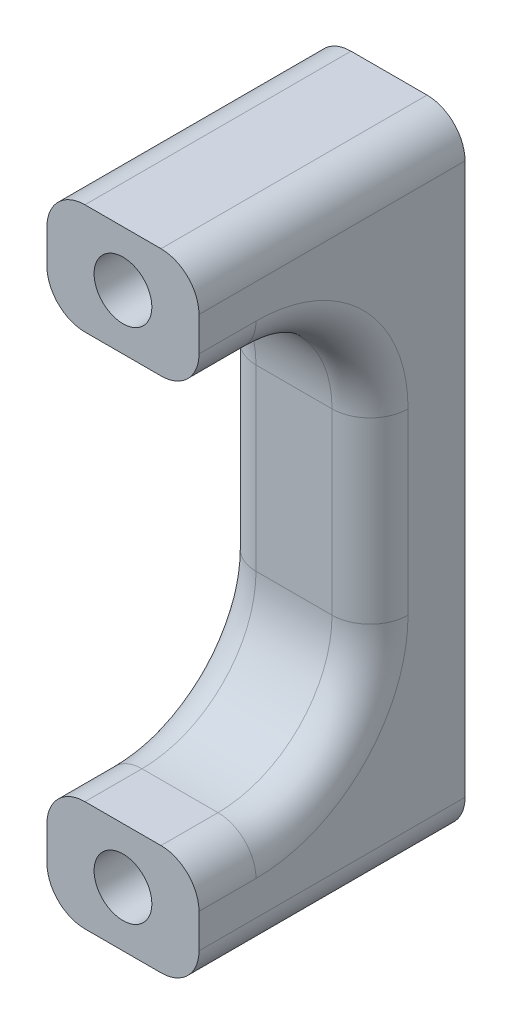
ISO-10303-21;
HEADER;
FILE_DESCRIPTION(('STEP AP214'),'2;1');
FILE_NAME('part.step','',(''),(''),'','','');
FILE_SCHEMA(('AUTOMOTIVE_DESIGN { 1 0 10303 214 1 1 1 1 }'));
ENDSEC;
DATA;
#1=APPLICATION_CONTEXT('core data for automotive mechanical design processes');
#2=APPLICATION_PROTOCOL_DEFINITION('international standard','automotive_design',2000,#1);
#3=PRODUCT_CONTEXT('',#1,'mechanical');
#4=PRODUCT('Part','Part','',(#3));
#5=PRODUCT_RELATED_PRODUCT_CATEGORY('part','',(#4));
#6=PRODUCT_DEFINITION_FORMATION('','',#4);
#7=PRODUCT_DEFINITION_CONTEXT('part definition',#1,'design');
#8=PRODUCT_DEFINITION('design','',#6,#7);
#9=PRODUCT_DEFINITION_SHAPE('','',#8);
#10=(LENGTH_UNIT() NAMED_UNIT(*) SI_UNIT(.MILLI.,.METRE.));
#11=(NAMED_UNIT(*) PLANE_ANGLE_UNIT() SI_UNIT($,.RADIAN.));
#12=(NAMED_UNIT(*) SI_UNIT($,.STERADIAN.) SOLID_ANGLE_UNIT());
#13=UNCERTAINTY_MEASURE_WITH_UNIT(LENGTH_MEASURE(1.E-05),#10,'distance_accuracy_value','');
#14=(GEOMETRIC_REPRESENTATION_CONTEXT(3) GLOBAL_UNCERTAINTY_ASSIGNED_CONTEXT((#13)) GLOBAL_UNIT_ASSIGNED_CONTEXT((#10,
#11,#12)) REPRESENTATION_CONTEXT('',''));
#15=CARTESIAN_POINT('',(0.,0.,0.));
#16=DIRECTION('',(0.,0.,1.));
#17=DIRECTION('',(1.,0.,0.));
#18=AXIS2_PLACEMENT_3D('',#15,#16,#17);
#19=CARTESIAN_POINT('',(0.,0.,17.78));
#20=DIRECTION('',(0.,0.,-1.));
#21=DIRECTION('',(-1.,0.,0.));
#22=AXIS2_PLACEMENT_3D('',#19,#20,#21);
#23=PLANE('',#22);
#24=DIRECTION('',(0.,1.,0.));
#25=VECTOR('',#24,1.);
#26=CARTESIAN_POINT('',(10.16,0.,17.78));
#27=LINE('',#26,#25);
#28=CARTESIAN_POINT('',(10.16,37.084,17.78));
#29=VERTEX_POINT('',#28);
#30=CARTESIAN_POINT('',(10.16,39.37,17.78));
#31=VERTEX_POINT('',#30);
#32=EDGE_CURVE('E302',#29,#31,#27,.T.);
#33=ORIENTED_EDGE('',*,*,#32,.T.);
#34=CARTESIAN_POINT('',(7.61999999999999,39.37,17.78));
#35=DIRECTION('',(0.,0.,-1.));
#36=DIRECTION('',(-1.,0.,0.));
#37=AXIS2_PLACEMENT_3D('',#34,#35,#36);
#38=CIRCLE('',#37,2.54);
#39=CARTESIAN_POINT('',(7.61999999999999,41.91,17.78));
#40=VERTEX_POINT('',#39);
#41=EDGE_CURVE('E438',#31,#40,#38,.F.);
#42=ORIENTED_EDGE('',*,*,#41,.T.);
#43=DIRECTION('',(-1.,0.,0.));
#44=VECTOR('',#43,1.);
#45=CARTESIAN_POINT('',(0.,41.91,17.78));
#46=LINE('',#45,#44);
#47=CARTESIAN_POINT('',(2.53999999999999,41.91,17.78));
#48=VERTEX_POINT('',#47);
#49=EDGE_CURVE('E307',#40,#48,#46,.T.);
#50=ORIENTED_EDGE('',*,*,#49,.T.);
#51=CARTESIAN_POINT('',(2.53999999999999,39.37,17.78));
#52=DIRECTION('',(0.,0.,-1.));
#53=DIRECTION('',(-1.,0.,0.));
#54=AXIS2_PLACEMENT_3D('',#51,#52,#53);
#55=CIRCLE('',#54,2.54);
#56=CARTESIAN_POINT('',(0.,39.37,17.78));
#57=VERTEX_POINT('',#56);
#58=EDGE_CURVE('E435',#48,#57,#55,.F.);
#59=ORIENTED_EDGE('',*,*,#58,.T.);
#60=DIRECTION('',(0.,-1.,0.));
#61=VECTOR('',#60,1.);
#62=CARTESIAN_POINT('',(0.,0.,17.78));
#63=LINE('',#62,#61);
#64=CARTESIAN_POINT('',(0.,37.084,17.78));
#65=VERTEX_POINT('',#64);
#66=EDGE_CURVE('E294',#57,#65,#63,.T.);
#67=ORIENTED_EDGE('',*,*,#66,.T.);
#68=CARTESIAN_POINT('',(2.53999999999999,37.084,17.78));
#69=DIRECTION('',(0.,0.,-1.));
#70=DIRECTION('',(-1.,0.,0.));
#71=AXIS2_PLACEMENT_3D('',#68,#69,#70);
#72=CIRCLE('',#71,2.54);
#73=CARTESIAN_POINT('',(2.53999999999999,34.544,17.78));
#74=VERTEX_POINT('',#73);
#75=EDGE_CURVE('E61',#65,#74,#72,.F.);
#76=ORIENTED_EDGE('',*,*,#75,.T.);
#77=DIRECTION('',(-1.,0.,0.));
#78=VECTOR('',#77,1.);
#79=CARTESIAN_POINT('',(0.,34.544,17.78));
#80=LINE('',#79,#78);
#81=CARTESIAN_POINT('',(7.61999999999999,34.544,17.78));
#82=VERTEX_POINT('',#81);
#83=EDGE_CURVE('E288',#82,#74,#80,.T.);
#84=ORIENTED_EDGE('',*,*,#83,.F.);
#85=CARTESIAN_POINT('',(7.61999999999999,37.084,17.78));
#86=DIRECTION('',(0.,0.,-1.));
#87=DIRECTION('',(-1.,0.,0.));
#88=AXIS2_PLACEMENT_3D('',#85,#86,#87);
#89=CIRCLE('',#88,2.54);
#90=EDGE_CURVE('E430',#82,#29,#89,.F.);
#91=ORIENTED_EDGE('',*,*,#90,.T.);
#92=EDGE_LOOP('',(#33,#42,#50,#59,#67,#76,#84,#91));
#93=FACE_BOUND('',#92,.T.);
#94=CARTESIAN_POINT('',(5.08,38.227,17.78));
#95=DIRECTION('',(0.,0.,1.));
#96=DIRECTION('',(1.,0.,0.));
#97=AXIS2_PLACEMENT_3D('',#94,#95,#96);
#98=CIRCLE('',#97,1.9304);
#99=CARTESIAN_POINT('',(7.0104,38.227,17.78));
#100=VERTEX_POINT('',#99);
#101=EDGE_CURVE('E278',#100,#100,#98,.T.);
#102=ORIENTED_EDGE('',*,*,#101,.F.);
#103=EDGE_LOOP('',(#102));
#104=FACE_BOUND('',#103,.T.);
#105=ADVANCED_FACE('F43',(#93,#104),#23,.F.);
#106=CARTESIAN_POINT('',(5.08,3.683,17.78));
#107=DIRECTION('',(0.,0.,1.));
#108=DIRECTION('',(1.,0.,0.));
#109=AXIS2_PLACEMENT_3D('',#106,#107,#108);
#110=CIRCLE('',#109,1.9304);
#111=CARTESIAN_POINT('',(7.0104,3.683,17.78));
#112=VERTEX_POINT('',#111);
#113=EDGE_CURVE('E265',#112,#112,#110,.T.);
#114=ORIENTED_EDGE('',*,*,#113,.F.);
#115=EDGE_LOOP('',(#114));
#116=FACE_BOUND('',#115,.T.);
#117=DIRECTION('',(1.,0.,0.));
#118=VECTOR('',#117,1.);
#119=CARTESIAN_POINT('',(0.,7.366,17.78));
#120=LINE('',#119,#118);
#121=CARTESIAN_POINT('',(2.54,7.366,17.78));
#122=VERTEX_POINT('',#121);
#123=CARTESIAN_POINT('',(7.62,7.366,17.78));
#124=VERTEX_POINT('',#123);
#125=EDGE_CURVE('E191',#122,#124,#120,.T.);
#126=ORIENTED_EDGE('',*,*,#125,.F.);
#127=CARTESIAN_POINT('',(2.54,4.826,17.78));
#128=DIRECTION('',(0.,0.,-1.));
#129=DIRECTION('',(-1.,0.,0.));
#130=AXIS2_PLACEMENT_3D('',#127,#128,#129);
#131=CIRCLE('',#130,2.54);
#132=CARTESIAN_POINT('',(0.,4.826,17.78));
#133=VERTEX_POINT('',#132);
#134=EDGE_CURVE('E345',#122,#133,#131,.F.);
#135=ORIENTED_EDGE('',*,*,#134,.T.);
#136=CARTESIAN_POINT('',(0.,2.54,17.78));
#137=VERTEX_POINT('',#136);
#138=EDGE_CURVE('E298',#133,#137,#63,.T.);
#139=ORIENTED_EDGE('',*,*,#138,.T.);
#140=CARTESIAN_POINT('',(2.54,2.54,17.78));
#141=DIRECTION('',(0.,0.,-1.));
#142=DIRECTION('',(-1.,0.,0.));
#143=AXIS2_PLACEMENT_3D('',#140,#141,#142);
#144=CIRCLE('',#143,2.54);
#145=CARTESIAN_POINT('',(2.54,0.,17.78));
#146=VERTEX_POINT('',#145);
#147=EDGE_CURVE('E339',#137,#146,#144,.F.);
#148=ORIENTED_EDGE('',*,*,#147,.T.);
#149=DIRECTION('',(1.,0.,0.));
#150=VECTOR('',#149,1.);
#151=CARTESIAN_POINT('',(0.,0.,17.78));
#152=LINE('',#151,#150);
#153=CARTESIAN_POINT('',(7.62,0.,17.78));
#154=VERTEX_POINT('',#153);
#155=EDGE_CURVE('E297',#146,#154,#152,.T.);
#156=ORIENTED_EDGE('',*,*,#155,.T.);
#157=CARTESIAN_POINT('',(7.62,2.54,17.78));
#158=DIRECTION('',(0.,0.,-1.));
#159=DIRECTION('',(-1.,0.,0.));
#160=AXIS2_PLACEMENT_3D('',#157,#158,#159);
#161=CIRCLE('',#160,2.54);
#162=CARTESIAN_POINT('',(10.16,2.54,17.78));
#163=VERTEX_POINT('',#162);
#164=EDGE_CURVE('E336',#154,#163,#161,.F.);
#165=ORIENTED_EDGE('',*,*,#164,.T.);
#166=CARTESIAN_POINT('',(10.16,4.826,17.78));
#167=VERTEX_POINT('',#166);
#168=EDGE_CURVE('E306',#163,#167,#27,.T.);
#169=ORIENTED_EDGE('',*,*,#168,.T.);
#170=CARTESIAN_POINT('',(7.62,4.826,17.78));
#171=DIRECTION('',(0.,0.,-1.));
#172=DIRECTION('',(-1.,0.,0.));
#173=AXIS2_PLACEMENT_3D('',#170,#171,#172);
#174=CIRCLE('',#173,2.54);
#175=EDGE_CURVE('E342',#167,#124,#174,.F.);
#176=ORIENTED_EDGE('',*,*,#175,.T.);
#177=EDGE_LOOP('',(#126,#135,#139,#148,#156,#165,#169,#176));
#178=FACE_BOUND('',#177,.T.);
#179=ADVANCED_FACE('F448',(#116,#178),#23,.F.);
#180=CARTESIAN_POINT('',(0.,0.,17.78));
#181=DIRECTION('',(1.,0.,0.));
#182=DIRECTION('',(0.,1.,0.));
#183=AXIS2_PLACEMENT_3D('',#180,#181,#182);
#184=PLANE('',#183);
#185=DIRECTION('',(0.,-1.,0.));
#186=VECTOR('',#185,1.);
#187=CARTESIAN_POINT('',(0.,0.,0.));
#188=LINE('',#187,#186);
#189=CARTESIAN_POINT('',(0.,39.37,0.));
#190=VERTEX_POINT('',#189);
#191=CARTESIAN_POINT('',(0.,2.54,0.));
#192=VERTEX_POINT('',#191);
#193=EDGE_CURVE('E291',#190,#192,#188,.T.);
#194=ORIENTED_EDGE('',*,*,#193,.T.);
#195=DIRECTION('',(0.,0.,-1.));
#196=VECTOR('',#195,1.);
#197=CARTESIAN_POINT('',(0.,2.54,17.78));
#198=LINE('',#197,#196);
#199=EDGE_CURVE('E219',#192,#137,#198,.F.);
#200=ORIENTED_EDGE('',*,*,#199,.T.);
#201=ORIENTED_EDGE('',*,*,#138,.F.);
#202=DIRECTION('',(0.,0.,1.));
#203=VECTOR('',#202,1.);
#204=CARTESIAN_POINT('',(0.,4.826,17.78));
#205=LINE('',#204,#203);
#206=CARTESIAN_POINT('',(0.,4.826,13.97));
#207=VERTEX_POINT('',#206);
#208=EDGE_CURVE('E360',#133,#207,#205,.F.);
#209=ORIENTED_EDGE('',*,*,#208,.T.);
#210=CARTESIAN_POINT('',(0.,14.986,13.97));
#211=DIRECTION('',(1.,0.,0.));
#212=DIRECTION('',(0.,1.,0.));
#213=AXIS2_PLACEMENT_3D('',#210,#211,#212);
#214=CIRCLE('',#213,10.16);
#215=CARTESIAN_POINT('',(0.,14.986,3.81));
#216=VERTEX_POINT('',#215);
#217=EDGE_CURVE('E357',#207,#216,#214,.T.);
#218=ORIENTED_EDGE('',*,*,#217,.T.);
#219=DIRECTION('',(0.,-1.,0.));
#220=VECTOR('',#219,1.);
#221=CARTESIAN_POINT('',(0.,0.,3.81));
#222=LINE('',#221,#220);
#223=CARTESIAN_POINT('',(0.,26.924,3.81));
#224=VERTEX_POINT('',#223);
#225=EDGE_CURVE('E354',#216,#224,#222,.F.);
#226=ORIENTED_EDGE('',*,*,#225,.T.);
#227=CARTESIAN_POINT('',(0.,26.924,13.97));
#228=DIRECTION('',(1.,0.,0.));
#229=DIRECTION('',(0.,1.,0.));
#230=AXIS2_PLACEMENT_3D('',#227,#228,#229);
#231=CIRCLE('',#230,10.16);
#232=CARTESIAN_POINT('',(0.,37.084,13.97));
#233=VERTEX_POINT('',#232);
#234=EDGE_CURVE('E351',#224,#233,#231,.T.);
#235=ORIENTED_EDGE('',*,*,#234,.T.);
#236=DIRECTION('',(0.,0.,1.));
#237=VECTOR('',#236,1.);
#238=CARTESIAN_POINT('',(0.,37.084,17.78));
#239=LINE('',#238,#237);
#240=EDGE_CURVE('E348',#233,#65,#239,.T.);
#241=ORIENTED_EDGE('',*,*,#240,.T.);
#242=ORIENTED_EDGE('',*,*,#66,.F.);
#243=DIRECTION('',(0.,0.,-1.));
#244=VECTOR('',#243,1.);
#245=CARTESIAN_POINT('',(0.,39.37,17.78));
#246=LINE('',#245,#244);
#247=EDGE_CURVE('E363',#57,#190,#246,.T.);
#248=ORIENTED_EDGE('',*,*,#247,.T.);
#249=EDGE_LOOP('',(#194,#200,#201,#209,#218,#226,#235,#241,#242,#248));
#250=FACE_BOUND('',#249,.T.);
#251=ADVANCED_FACE('F495',(#250),#184,.F.);
#252=CARTESIAN_POINT('',(0.,0.,17.78));
#253=DIRECTION('',(0.,1.,0.));
#254=DIRECTION('',(0.,0.,1.));
#255=AXIS2_PLACEMENT_3D('',#252,#253,#254);
#256=PLANE('',#255);
#257=ORIENTED_EDGE('',*,*,#155,.F.);
#258=DIRECTION('',(0.,0.,-1.));
#259=VECTOR('',#258,1.);
#260=CARTESIAN_POINT('',(2.54,0.,17.78));
#261=LINE('',#260,#259);
#262=CARTESIAN_POINT('',(2.54,0.,0.));
#263=VERTEX_POINT('',#262);
#264=EDGE_CURVE('E407',#146,#263,#261,.T.);
#265=ORIENTED_EDGE('',*,*,#264,.T.);
#266=DIRECTION('',(1.,0.,0.));
#267=VECTOR('',#266,1.);
#268=CARTESIAN_POINT('',(0.,0.,0.));
#269=LINE('',#268,#267);
#270=CARTESIAN_POINT('',(7.62,0.,0.));
#271=VERTEX_POINT('',#270);
#272=EDGE_CURVE('E315',#263,#271,#269,.T.);
#273=ORIENTED_EDGE('',*,*,#272,.T.);
#274=DIRECTION('',(0.,0.,-1.));
#275=VECTOR('',#274,1.);
#276=CARTESIAN_POINT('',(7.62,0.,17.78));
#277=LINE('',#276,#275);
#278=EDGE_CURVE('E404',#271,#154,#277,.F.);
#279=ORIENTED_EDGE('',*,*,#278,.T.);
#280=EDGE_LOOP('',(#257,#265,#273,#279));
#281=FACE_BOUND('',#280,.T.);
#282=ADVANCED_FACE('F457',(#281),#256,.F.);
#283=CARTESIAN_POINT('',(10.16,0.,17.78));
#284=DIRECTION('',(-1.,0.,0.));
#285=DIRECTION('',(0.,-1.,0.));
#286=AXIS2_PLACEMENT_3D('',#283,#284,#285);
#287=PLANE('',#286);
#288=ORIENTED_EDGE('',*,*,#168,.F.);
#289=DIRECTION('',(0.,0.,-1.));
#290=VECTOR('',#289,1.);
#291=CARTESIAN_POINT('',(10.16,2.54,17.78));
#292=LINE('',#291,#290);
#293=CARTESIAN_POINT('',(10.16,2.54,0.));
#294=VERTEX_POINT('',#293);
#295=EDGE_CURVE('E400',#163,#294,#292,.T.);
#296=ORIENTED_EDGE('',*,*,#295,.T.);
#297=DIRECTION('',(0.,1.,0.));
#298=VECTOR('',#297,1.);
#299=CARTESIAN_POINT('',(10.16,0.,0.));
#300=LINE('',#299,#298);
#301=CARTESIAN_POINT('',(10.16,39.37,0.));
#302=VERTEX_POINT('',#301);
#303=EDGE_CURVE('E319',#294,#302,#300,.T.);
#304=ORIENTED_EDGE('',*,*,#303,.T.);
#305=DIRECTION('',(0.,0.,-1.));
#306=VECTOR('',#305,1.);
#307=CARTESIAN_POINT('',(10.16,39.37,17.78));
#308=LINE('',#307,#306);
#309=EDGE_CURVE('E397',#302,#31,#308,.F.);
#310=ORIENTED_EDGE('',*,*,#309,.T.);
#311=ORIENTED_EDGE('',*,*,#32,.F.);
#312=DIRECTION('',(0.,0.,1.));
#313=VECTOR('',#312,1.);
#314=CARTESIAN_POINT('',(10.16,37.084,17.78));
#315=LINE('',#314,#313);
#316=CARTESIAN_POINT('',(10.16,37.084,13.97));
#317=VERTEX_POINT('',#316);
#318=EDGE_CURVE('E383',#29,#317,#315,.F.);
#319=ORIENTED_EDGE('',*,*,#318,.T.);
#320=CARTESIAN_POINT('',(10.16,26.924,13.97));
#321=DIRECTION('',(-1.,0.,0.));
#322=DIRECTION('',(0.,-1.,0.));
#323=AXIS2_PLACEMENT_3D('',#320,#321,#322);
#324=CIRCLE('',#323,10.16);
#325=CARTESIAN_POINT('',(10.16,26.924,3.81));
#326=VERTEX_POINT('',#325);
#327=EDGE_CURVE('E386',#317,#326,#324,.T.);
#328=ORIENTED_EDGE('',*,*,#327,.T.);
#329=DIRECTION('',(0.,1.,0.));
#330=VECTOR('',#329,1.);
#331=CARTESIAN_POINT('',(10.16,0.,3.81));
#332=LINE('',#331,#330);
#333=CARTESIAN_POINT('',(10.16,14.986,3.81));
#334=VERTEX_POINT('',#333);
#335=EDGE_CURVE('E389',#326,#334,#332,.F.);
#336=ORIENTED_EDGE('',*,*,#335,.T.);
#337=CARTESIAN_POINT('',(10.16,14.986,13.97));
#338=DIRECTION('',(-1.,0.,0.));
#339=DIRECTION('',(0.,-1.,0.));
#340=AXIS2_PLACEMENT_3D('',#337,#338,#339);
#341=CIRCLE('',#340,10.16);
#342=CARTESIAN_POINT('',(10.16,4.826,13.97));
#343=VERTEX_POINT('',#342);
#344=EDGE_CURVE('E392',#334,#343,#341,.T.);
#345=ORIENTED_EDGE('',*,*,#344,.T.);
#346=DIRECTION('',(0.,0.,1.));
#347=VECTOR('',#346,1.);
#348=CARTESIAN_POINT('',(10.16,4.826,17.78));
#349=LINE('',#348,#347);
#350=EDGE_CURVE('E223',#343,#167,#349,.T.);
#351=ORIENTED_EDGE('',*,*,#350,.T.);
#352=EDGE_LOOP('',(#288,#296,#304,#310,#311,#319,#328,#336,#345,#351));
#353=FACE_BOUND('',#352,.T.);
#354=ADVANCED_FACE('F469',(#353),#287,.F.);
#355=CARTESIAN_POINT('',(0.,41.91,17.78));
#356=DIRECTION('',(0.,-1.,0.));
#357=DIRECTION('',(0.,0.,-1.));
#358=AXIS2_PLACEMENT_3D('',#355,#356,#357);
#359=PLANE('',#358);
#360=ORIENTED_EDGE('',*,*,#49,.F.);
#361=DIRECTION('',(0.,0.,-1.));
#362=VECTOR('',#361,1.);
#363=CARTESIAN_POINT('',(7.61999999999999,41.91,17.78));
#364=LINE('',#363,#362);
#365=CARTESIAN_POINT('',(7.61999999999999,41.91,0.));
#366=VERTEX_POINT('',#365);
#367=EDGE_CURVE('E426',#40,#366,#364,.T.);
#368=ORIENTED_EDGE('',*,*,#367,.T.);
#369=DIRECTION('',(-1.,0.,0.));
#370=VECTOR('',#369,1.);
#371=CARTESIAN_POINT('',(0.,41.91,0.));
#372=LINE('',#371,#370);
#373=CARTESIAN_POINT('',(2.53999999999999,41.91,0.));
#374=VERTEX_POINT('',#373);
#375=EDGE_CURVE('E323',#366,#374,#372,.T.);
#376=ORIENTED_EDGE('',*,*,#375,.T.);
#377=DIRECTION('',(0.,0.,-1.));
#378=VECTOR('',#377,1.);
#379=CARTESIAN_POINT('',(2.53999999999999,41.91,17.78));
#380=LINE('',#379,#378);
#381=EDGE_CURVE('E423',#374,#48,#380,.F.);
#382=ORIENTED_EDGE('',*,*,#381,.T.);
#383=EDGE_LOOP('',(#360,#368,#376,#382));
#384=FACE_BOUND('',#383,.T.);
#385=ADVANCED_FACE('F503',(#384),#359,.F.);
#386=CARTESIAN_POINT('',(0.,0.,0.));
#387=DIRECTION('',(0.,0.,-1.));
#388=DIRECTION('',(-1.,0.,0.));
#389=AXIS2_PLACEMENT_3D('',#386,#387,#388);
#390=PLANE('',#389);
#391=CARTESIAN_POINT('',(5.08,3.683,0.));
#392=DIRECTION('',(0.,0.,-1.));
#393=DIRECTION('',(-1.,0.,0.));
#394=AXIS2_PLACEMENT_3D('',#391,#392,#393);
#395=CIRCLE('',#394,1.9304);
#396=CARTESIAN_POINT('',(3.14960000000001,3.683,0.));
#397=VERTEX_POINT('',#396);
#398=EDGE_CURVE('E272',#397,#397,#395,.T.);
#399=ORIENTED_EDGE('',*,*,#398,.F.);
#400=EDGE_LOOP('',(#399));
#401=FACE_BOUND('',#400,.T.);
#402=CARTESIAN_POINT('',(5.08,38.227,0.));
#403=DIRECTION('',(0.,0.,-1.));
#404=DIRECTION('',(-1.,0.,0.));
#405=AXIS2_PLACEMENT_3D('',#402,#403,#404);
#406=CIRCLE('',#405,1.9304);
#407=CARTESIAN_POINT('',(3.14960000000001,38.227,0.));
#408=VERTEX_POINT('',#407);
#409=EDGE_CURVE('E284',#408,#408,#406,.T.);
#410=ORIENTED_EDGE('',*,*,#409,.F.);
#411=EDGE_LOOP('',(#410));
#412=FACE_BOUND('',#411,.T.);
#413=ORIENTED_EDGE('',*,*,#272,.F.);
#414=CARTESIAN_POINT('',(2.54,2.54,0.));
#415=DIRECTION('',(0.,0.,-1.));
#416=DIRECTION('',(-1.,0.,0.));
#417=AXIS2_PLACEMENT_3D('',#414,#415,#416);
#418=CIRCLE('',#417,2.54);
#419=EDGE_CURVE('E420',#263,#192,#418,.T.);
#420=ORIENTED_EDGE('',*,*,#419,.T.);
#421=ORIENTED_EDGE('',*,*,#193,.F.);
#422=CARTESIAN_POINT('',(2.53999999999999,39.37,0.));
#423=DIRECTION('',(0.,0.,-1.));
#424=DIRECTION('',(-1.,0.,0.));
#425=AXIS2_PLACEMENT_3D('',#422,#423,#424);
#426=CIRCLE('',#425,2.54);
#427=EDGE_CURVE('E411',#190,#374,#426,.T.);
#428=ORIENTED_EDGE('',*,*,#427,.T.);
#429=ORIENTED_EDGE('',*,*,#375,.F.);
#430=CARTESIAN_POINT('',(7.61999999999999,39.37,0.));
#431=DIRECTION('',(0.,0.,-1.));
#432=DIRECTION('',(-1.,0.,0.));
#433=AXIS2_PLACEMENT_3D('',#430,#431,#432);
#434=CIRCLE('',#433,2.54);
#435=EDGE_CURVE('E414',#366,#302,#434,.T.);
#436=ORIENTED_EDGE('',*,*,#435,.T.);
#437=ORIENTED_EDGE('',*,*,#303,.F.);
#438=CARTESIAN_POINT('',(7.62,2.54,0.));
#439=DIRECTION('',(0.,0.,-1.));
#440=DIRECTION('',(-1.,0.,0.));
#441=AXIS2_PLACEMENT_3D('',#438,#439,#440);
#442=CIRCLE('',#441,2.54);
#443=EDGE_CURVE('E417',#294,#271,#442,.T.);
#444=ORIENTED_EDGE('',*,*,#443,.T.);
#445=EDGE_LOOP('',(#413,#420,#421,#428,#429,#436,#437,#444));
#446=FACE_BOUND('',#445,.T.);
#447=ADVANCED_FACE('F460',(#401,#412,#446),#390,.T.);
#448=CARTESIAN_POINT('',(0.,0.,6.35));
#449=DIRECTION('',(0.,0.,-1.));
#450=DIRECTION('',(-1.,0.,0.));
#451=AXIS2_PLACEMENT_3D('',#448,#449,#450);
#452=PLANE('',#451);
#453=DIRECTION('',(-1.,0.,0.));
#454=VECTOR('',#453,1.);
#455=CARTESIAN_POINT('',(0.,26.924,6.35));
#456=LINE('',#455,#454);
#457=CARTESIAN_POINT('',(7.62,26.924,6.35));
#458=VERTEX_POINT('',#457);
#459=CARTESIAN_POINT('',(2.54,26.924,6.35));
#460=VERTEX_POINT('',#459);
#461=EDGE_CURVE('E311',#458,#460,#456,.T.);
#462=ORIENTED_EDGE('',*,*,#461,.T.);
#463=DIRECTION('',(0.,-1.,0.));
#464=VECTOR('',#463,1.);
#465=CARTESIAN_POINT('',(2.54,0.,6.35));
#466=LINE('',#465,#464);
#467=CARTESIAN_POINT('',(2.54,14.986,6.35));
#468=VERTEX_POINT('',#467);
#469=EDGE_CURVE('E374',#460,#468,#466,.T.);
#470=ORIENTED_EDGE('',*,*,#469,.T.);
#471=DIRECTION('',(1.,0.,0.));
#472=VECTOR('',#471,1.);
#473=CARTESIAN_POINT('',(10.16,14.986,6.35));
#474=LINE('',#473,#472);
#475=CARTESIAN_POINT('',(7.62,14.986,6.35));
#476=VERTEX_POINT('',#475);
#477=EDGE_CURVE('E207',#468,#476,#474,.T.);
#478=ORIENTED_EDGE('',*,*,#477,.T.);
#479=DIRECTION('',(0.,1.,0.));
#480=VECTOR('',#479,1.);
#481=CARTESIAN_POINT('',(7.62,0.,6.35));
#482=LINE('',#481,#480);
#483=EDGE_CURVE('E371',#476,#458,#482,.T.);
#484=ORIENTED_EDGE('',*,*,#483,.T.);
#485=EDGE_LOOP('',(#462,#470,#478,#484));
#486=FACE_BOUND('',#485,.T.);
#487=ADVANCED_FACE('F474',(#486),#452,.F.);
#488=CARTESIAN_POINT('',(0.,7.366,-29.014983784245));
#489=DIRECTION('',(0.,-1.,0.));
#490=DIRECTION('',(0.,0.,-1.));
#491=AXIS2_PLACEMENT_3D('',#488,#489,#490);
#492=PLANE('',#491);
#493=DIRECTION('',(1.,0.,0.));
#494=VECTOR('',#493,1.);
#495=CARTESIAN_POINT('',(0.,7.366,13.97));
#496=LINE('',#495,#494);
#497=CARTESIAN_POINT('',(7.62,7.366,13.97));
#498=VERTEX_POINT('',#497);
#499=CARTESIAN_POINT('',(2.54,7.366,13.97));
#500=VERTEX_POINT('',#499);
#501=EDGE_CURVE('E188',#498,#500,#496,.F.);
#502=ORIENTED_EDGE('',*,*,#501,.T.);
#503=DIRECTION('',(0.,0.,1.));
#504=VECTOR('',#503,1.);
#505=CARTESIAN_POINT('',(2.54,7.366,-29.014983784245));
#506=LINE('',#505,#504);
#507=EDGE_CURVE('E195',#500,#122,#506,.T.);
#508=ORIENTED_EDGE('',*,*,#507,.T.);
#509=ORIENTED_EDGE('',*,*,#125,.T.);
#510=DIRECTION('',(0.,0.,1.));
#511=VECTOR('',#510,1.);
#512=CARTESIAN_POINT('',(7.62,7.366,-29.014983784245));
#513=LINE('',#512,#511);
#514=EDGE_CURVE('E184',#124,#498,#513,.F.);
#515=ORIENTED_EDGE('',*,*,#514,.T.);
#516=EDGE_LOOP('',(#502,#508,#509,#515));
#517=FACE_BOUND('',#516,.T.);
#518=ADVANCED_FACE('F186',(#517),#492,.F.);
#519=CARTESIAN_POINT('',(0.,34.544,-29.014983784245));
#520=DIRECTION('',(0.,1.,0.));
#521=DIRECTION('',(0.,0.,1.));
#522=AXIS2_PLACEMENT_3D('',#519,#520,#521);
#523=PLANE('',#522);
#524=ORIENTED_EDGE('',*,*,#83,.T.);
#525=DIRECTION('',(0.,0.,1.));
#526=VECTOR('',#525,1.);
#527=CARTESIAN_POINT('',(2.53999999999999,34.544,-29.014983784245));
#528=LINE('',#527,#526);
#529=CARTESIAN_POINT('',(2.53999999999999,34.544,13.97));
#530=VERTEX_POINT('',#529);
#531=EDGE_CURVE('E12',#74,#530,#528,.F.);
#532=ORIENTED_EDGE('',*,*,#531,.T.);
#533=DIRECTION('',(-1.,0.,0.));
#534=VECTOR('',#533,1.);
#535=CARTESIAN_POINT('',(10.16,34.544,13.97));
#536=LINE('',#535,#534);
#537=CARTESIAN_POINT('',(7.61999999999999,34.544,13.97));
#538=VERTEX_POINT('',#537);
#539=EDGE_CURVE('E196',#530,#538,#536,.F.);
#540=ORIENTED_EDGE('',*,*,#539,.T.);
#541=DIRECTION('',(0.,0.,1.));
#542=VECTOR('',#541,1.);
#543=CARTESIAN_POINT('',(7.61999999999999,34.544,-29.014983784245));
#544=LINE('',#543,#542);
#545=EDGE_CURVE('E53',#538,#82,#544,.T.);
#546=ORIENTED_EDGE('',*,*,#545,.T.);
#547=EDGE_LOOP('',(#524,#532,#540,#546));
#548=FACE_BOUND('',#547,.T.);
#549=ADVANCED_FACE('F656',(#548),#523,.F.);
#550=CARTESIAN_POINT('',(5.08,38.227,17.78));
#551=DIRECTION('',(0.,0.,1.));
#552=DIRECTION('',(1.,0.,0.));
#553=AXIS2_PLACEMENT_3D('',#550,#551,#552);
#554=CYLINDRICAL_SURFACE('',#553,1.9304);
#555=ORIENTED_EDGE('',*,*,#101,.T.);
#556=EDGE_LOOP('',(#555));
#557=FACE_BOUND('',#556,.T.);
#558=ORIENTED_EDGE('',*,*,#409,.T.);
#559=EDGE_LOOP('',(#558));
#560=FACE_BOUND('',#559,.T.);
#561=ADVANCED_FACE('F648',(#557,#560),#554,.F.);
#562=CARTESIAN_POINT('',(5.08,3.683,17.78));
#563=DIRECTION('',(0.,0.,1.));
#564=DIRECTION('',(1.,0.,0.));
#565=AXIS2_PLACEMENT_3D('',#562,#563,#564);
#566=CYLINDRICAL_SURFACE('',#565,1.9304);
#567=ORIENTED_EDGE('',*,*,#113,.T.);
#568=EDGE_LOOP('',(#567));
#569=FACE_BOUND('',#568,.T.);
#570=ORIENTED_EDGE('',*,*,#398,.T.);
#571=EDGE_LOOP('',(#570));
#572=FACE_BOUND('',#571,.T.);
#573=ADVANCED_FACE('F516',(#569,#572),#566,.F.);
#574=CARTESIAN_POINT('',(0.,14.986,13.97));
#575=DIRECTION('',(-1.,0.,0.));
#576=DIRECTION('',(0.,0.,1.));
#577=AXIS2_PLACEMENT_3D('',#574,#575,#576);
#578=CYLINDRICAL_SURFACE('',#577,7.62);
#579=ORIENTED_EDGE('',*,*,#477,.F.);
#580=CARTESIAN_POINT('',(2.54,14.986,13.97));
#581=DIRECTION('',(1.,0.,0.));
#582=DIRECTION('',(0.,1.,0.));
#583=AXIS2_PLACEMENT_3D('',#580,#581,#582);
#584=CIRCLE('',#583,7.62);
#585=EDGE_CURVE('E205',#468,#500,#584,.F.);
#586=ORIENTED_EDGE('',*,*,#585,.T.);
#587=ORIENTED_EDGE('',*,*,#501,.F.);
#588=CARTESIAN_POINT('',(7.62,14.986,13.97));
#589=DIRECTION('',(-1.,0.,0.));
#590=DIRECTION('',(0.,-1.,0.));
#591=AXIS2_PLACEMENT_3D('',#588,#589,#590);
#592=CIRCLE('',#591,7.62);
#593=EDGE_CURVE('E202',#498,#476,#592,.F.);
#594=ORIENTED_EDGE('',*,*,#593,.T.);
#595=EDGE_LOOP('',(#579,#586,#587,#594));
#596=FACE_BOUND('',#595,.T.);
#597=ADVANCED_FACE('F201',(#596),#578,.F.);
#598=CARTESIAN_POINT('',(0.,26.924,13.97));
#599=DIRECTION('',(1.,0.,0.));
#600=DIRECTION('',(0.,0.,-1.));
#601=AXIS2_PLACEMENT_3D('',#598,#599,#600);
#602=CYLINDRICAL_SURFACE('',#601,7.62);
#603=ORIENTED_EDGE('',*,*,#539,.F.);
#604=CARTESIAN_POINT('',(2.54,26.924,13.97));
#605=DIRECTION('',(1.,0.,0.));
#606=DIRECTION('',(0.,1.,0.));
#607=AXIS2_PLACEMENT_3D('',#604,#605,#606);
#608=CIRCLE('',#607,7.62);
#609=EDGE_CURVE('E380',#530,#460,#608,.F.);
#610=ORIENTED_EDGE('',*,*,#609,.T.);
#611=ORIENTED_EDGE('',*,*,#461,.F.);
#612=CARTESIAN_POINT('',(7.62,26.924,13.97));
#613=DIRECTION('',(-1.,0.,0.));
#614=DIRECTION('',(0.,-1.,0.));
#615=AXIS2_PLACEMENT_3D('',#612,#613,#614);
#616=CIRCLE('',#615,7.62);
#617=EDGE_CURVE('E377',#458,#538,#616,.F.);
#618=ORIENTED_EDGE('',*,*,#617,.T.);
#619=EDGE_LOOP('',(#603,#610,#611,#618));
#620=FACE_BOUND('',#619,.T.);
#621=ADVANCED_FACE('F477',(#620),#602,.F.);
#622=CARTESIAN_POINT('',(2.53999999999999,37.084,17.78));
#623=DIRECTION('',(0.,0.,1.));
#624=DIRECTION('',(1.,0.,0.));
#625=AXIS2_PLACEMENT_3D('',#622,#623,#624);
#626=CYLINDRICAL_SURFACE('',#625,2.54);
#627=ORIENTED_EDGE('',*,*,#75,.F.);
#628=ORIENTED_EDGE('',*,*,#240,.F.);
#629=CARTESIAN_POINT('',(2.53999999999999,37.084,13.97));
#630=DIRECTION('',(0.,0.,-1.));
#631=DIRECTION('',(-1.,0.,0.));
#632=AXIS2_PLACEMENT_3D('',#629,#630,#631);
#633=CIRCLE('',#632,2.54);
#634=EDGE_CURVE('E230',#530,#233,#633,.T.);
#635=ORIENTED_EDGE('',*,*,#634,.F.);
#636=ORIENTED_EDGE('',*,*,#531,.F.);
#637=EDGE_LOOP('',(#627,#628,#635,#636));
#638=FACE_BOUND('',#637,.T.);
#639=ADVANCED_FACE('F519',(#638),#626,.T.);
#640=CARTESIAN_POINT('',(2.54,26.924,13.97));
#641=DIRECTION('',(1.,0.,0.));
#642=DIRECTION('',(0.,1.,0.));
#643=AXIS2_PLACEMENT_3D('',#640,#641,#642);
#644=TOROIDAL_SURFACE('',#643,10.16,2.54);
#645=ORIENTED_EDGE('',*,*,#634,.T.);
#646=ORIENTED_EDGE('',*,*,#234,.F.);
#647=CARTESIAN_POINT('',(2.54,26.924,3.81));
#648=DIRECTION('',(0.,-1.,0.));
#649=DIRECTION('',(0.,0.,-1.));
#650=AXIS2_PLACEMENT_3D('',#647,#648,#649);
#651=CIRCLE('',#650,2.54);
#652=EDGE_CURVE('E254',#460,#224,#651,.T.);
#653=ORIENTED_EDGE('',*,*,#652,.F.);
#654=ORIENTED_EDGE('',*,*,#609,.F.);
#655=EDGE_LOOP('',(#645,#646,#653,#654));
#656=FACE_BOUND('',#655,.T.);
#657=ADVANCED_FACE('F529',(#656),#644,.T.);
#658=CARTESIAN_POINT('',(2.54,0.,3.81));
#659=DIRECTION('',(0.,-1.,0.));
#660=DIRECTION('',(1.,0.,0.));
#661=AXIS2_PLACEMENT_3D('',#658,#659,#660);
#662=CYLINDRICAL_SURFACE('',#661,2.54);
#663=ORIENTED_EDGE('',*,*,#652,.T.);
#664=ORIENTED_EDGE('',*,*,#225,.F.);
#665=CARTESIAN_POINT('',(2.54,14.986,3.81));
#666=DIRECTION('',(0.,-1.,0.));
#667=DIRECTION('',(0.,0.,-1.));
#668=AXIS2_PLACEMENT_3D('',#665,#666,#667);
#669=CIRCLE('',#668,2.54);
#670=EDGE_CURVE('E247',#468,#216,#669,.T.);
#671=ORIENTED_EDGE('',*,*,#670,.F.);
#672=ORIENTED_EDGE('',*,*,#469,.F.);
#673=EDGE_LOOP('',(#663,#664,#671,#672));
#674=FACE_BOUND('',#673,.T.);
#675=ADVANCED_FACE('F525',(#674),#662,.T.);
#676=CARTESIAN_POINT('',(2.54,14.986,13.97));
#677=DIRECTION('',(1.,0.,0.));
#678=DIRECTION('',(0.,1.,0.));
#679=AXIS2_PLACEMENT_3D('',#676,#677,#678);
#680=TOROIDAL_SURFACE('',#679,10.16,2.54);
#681=ORIENTED_EDGE('',*,*,#670,.T.);
#682=ORIENTED_EDGE('',*,*,#217,.F.);
#683=CARTESIAN_POINT('',(2.54,4.826,13.97));
#684=DIRECTION('',(0.,0.,1.));
#685=DIRECTION('',(1.,0.,0.));
#686=AXIS2_PLACEMENT_3D('',#683,#684,#685);
#687=CIRCLE('',#686,2.54);
#688=EDGE_CURVE('E240',#500,#207,#687,.T.);
#689=ORIENTED_EDGE('',*,*,#688,.F.);
#690=ORIENTED_EDGE('',*,*,#585,.F.);
#691=EDGE_LOOP('',(#681,#682,#689,#690));
#692=FACE_BOUND('',#691,.T.);
#693=ADVANCED_FACE('F522',(#692),#680,.T.);
#694=CARTESIAN_POINT('',(2.54,4.826,-29.014983784245));
#695=DIRECTION('',(0.,0.,1.));
#696=DIRECTION('',(1.,0.,0.));
#697=AXIS2_PLACEMENT_3D('',#694,#695,#696);
#698=CYLINDRICAL_SURFACE('',#697,2.54);
#699=ORIENTED_EDGE('',*,*,#688,.T.);
#700=ORIENTED_EDGE('',*,*,#208,.F.);
#701=ORIENTED_EDGE('',*,*,#134,.F.);
#702=ORIENTED_EDGE('',*,*,#507,.F.);
#703=EDGE_LOOP('',(#699,#700,#701,#702));
#704=FACE_BOUND('',#703,.T.);
#705=ADVANCED_FACE('F487',(#704),#698,.T.);
#706=CARTESIAN_POINT('',(7.61999999999999,37.084,-29.014983784245));
#707=DIRECTION('',(0.,0.,1.));
#708=DIRECTION('',(1.,0.,0.));
#709=AXIS2_PLACEMENT_3D('',#706,#707,#708);
#710=CYLINDRICAL_SURFACE('',#709,2.54);
#711=ORIENTED_EDGE('',*,*,#90,.F.);
#712=ORIENTED_EDGE('',*,*,#545,.F.);
#713=CARTESIAN_POINT('',(7.61999999999999,37.084,13.97));
#714=DIRECTION('',(0.,0.,-1.));
#715=DIRECTION('',(-1.,0.,0.));
#716=AXIS2_PLACEMENT_3D('',#713,#714,#715);
#717=CIRCLE('',#716,2.54);
#718=EDGE_CURVE('E47',#317,#538,#717,.T.);
#719=ORIENTED_EDGE('',*,*,#718,.F.);
#720=ORIENTED_EDGE('',*,*,#318,.F.);
#721=EDGE_LOOP('',(#711,#712,#719,#720));
#722=FACE_BOUND('',#721,.T.);
#723=ADVANCED_FACE('F480',(#722),#710,.T.);
#724=CARTESIAN_POINT('',(7.62,26.924,13.97));
#725=DIRECTION('',(-1.,0.,0.));
#726=DIRECTION('',(0.,-1.,0.));
#727=AXIS2_PLACEMENT_3D('',#724,#725,#726);
#728=TOROIDAL_SURFACE('',#727,10.16,2.54);
#729=ORIENTED_EDGE('',*,*,#718,.T.);
#730=ORIENTED_EDGE('',*,*,#617,.F.);
#731=CARTESIAN_POINT('',(7.62,26.924,3.81));
#732=DIRECTION('',(0.,-1.,0.));
#733=DIRECTION('',(0.,0.,-1.));
#734=AXIS2_PLACEMENT_3D('',#731,#732,#733);
#735=CIRCLE('',#734,2.54);
#736=EDGE_CURVE('E227',#326,#458,#735,.T.);
#737=ORIENTED_EDGE('',*,*,#736,.F.);
#738=ORIENTED_EDGE('',*,*,#327,.F.);
#739=EDGE_LOOP('',(#729,#730,#737,#738));
#740=FACE_BOUND('',#739,.T.);
#741=ADVANCED_FACE('F478',(#740),#728,.T.);
#742=CARTESIAN_POINT('',(7.62,0.,3.81));
#743=DIRECTION('',(0.,1.,0.));
#744=DIRECTION('',(-1.,0.,0.));
#745=AXIS2_PLACEMENT_3D('',#742,#743,#744);
#746=CYLINDRICAL_SURFACE('',#745,2.54);
#747=ORIENTED_EDGE('',*,*,#736,.T.);
#748=ORIENTED_EDGE('',*,*,#483,.F.);
#749=CARTESIAN_POINT('',(7.62,14.986,3.81));
#750=DIRECTION('',(0.,-1.,0.));
#751=DIRECTION('',(0.,0.,-1.));
#752=AXIS2_PLACEMENT_3D('',#749,#750,#751);
#753=CIRCLE('',#752,2.54);
#754=EDGE_CURVE('E217',#334,#476,#753,.T.);
#755=ORIENTED_EDGE('',*,*,#754,.F.);
#756=ORIENTED_EDGE('',*,*,#335,.F.);
#757=EDGE_LOOP('',(#747,#748,#755,#756));
#758=FACE_BOUND('',#757,.T.);
#759=ADVANCED_FACE('F471',(#758),#746,.T.);
#760=CARTESIAN_POINT('',(7.62,14.986,13.97));
#761=DIRECTION('',(-1.,0.,0.));
#762=DIRECTION('',(0.,-1.,0.));
#763=AXIS2_PLACEMENT_3D('',#760,#761,#762);
#764=TOROIDAL_SURFACE('',#763,10.16,2.54);
#765=ORIENTED_EDGE('',*,*,#754,.T.);
#766=ORIENTED_EDGE('',*,*,#593,.F.);
#767=CARTESIAN_POINT('',(7.62,4.826,13.97));
#768=DIRECTION('',(0.,0.,1.));
#769=DIRECTION('',(1.,0.,0.));
#770=AXIS2_PLACEMENT_3D('',#767,#768,#769);
#771=CIRCLE('',#770,2.54);
#772=EDGE_CURVE('E214',#343,#498,#771,.T.);
#773=ORIENTED_EDGE('',*,*,#772,.F.);
#774=ORIENTED_EDGE('',*,*,#344,.F.);
#775=EDGE_LOOP('',(#765,#766,#773,#774));
#776=FACE_BOUND('',#775,.T.);
#777=ADVANCED_FACE('F212',(#776),#764,.T.);
#778=CARTESIAN_POINT('',(7.62,4.826,17.78));
#779=DIRECTION('',(0.,0.,1.));
#780=DIRECTION('',(1.,0.,0.));
#781=AXIS2_PLACEMENT_3D('',#778,#779,#780);
#782=CYLINDRICAL_SURFACE('',#781,2.54);
#783=ORIENTED_EDGE('',*,*,#772,.T.);
#784=ORIENTED_EDGE('',*,*,#514,.F.);
#785=ORIENTED_EDGE('',*,*,#175,.F.);
#786=ORIENTED_EDGE('',*,*,#350,.F.);
#787=EDGE_LOOP('',(#783,#784,#785,#786));
#788=FACE_BOUND('',#787,.T.);
#789=ADVANCED_FACE('F221',(#788),#782,.T.);
#790=CARTESIAN_POINT('',(2.54,2.54,17.78));
#791=DIRECTION('',(0.,0.,-1.));
#792=DIRECTION('',(-1.,0.,0.));
#793=AXIS2_PLACEMENT_3D('',#790,#791,#792);
#794=CYLINDRICAL_SURFACE('',#793,2.54);
#795=ORIENTED_EDGE('',*,*,#147,.F.);
#796=ORIENTED_EDGE('',*,*,#199,.F.);
#797=ORIENTED_EDGE('',*,*,#419,.F.);
#798=ORIENTED_EDGE('',*,*,#264,.F.);
#799=EDGE_LOOP('',(#795,#796,#797,#798));
#800=FACE_BOUND('',#799,.T.);
#801=ADVANCED_FACE('F454',(#800),#794,.T.);
#802=CARTESIAN_POINT('',(7.62,2.54,17.78));
#803=DIRECTION('',(0.,0.,-1.));
#804=DIRECTION('',(-1.,0.,0.));
#805=AXIS2_PLACEMENT_3D('',#802,#803,#804);
#806=CYLINDRICAL_SURFACE('',#805,2.54);
#807=ORIENTED_EDGE('',*,*,#164,.F.);
#808=ORIENTED_EDGE('',*,*,#278,.F.);
#809=ORIENTED_EDGE('',*,*,#443,.F.);
#810=ORIENTED_EDGE('',*,*,#295,.F.);
#811=EDGE_LOOP('',(#807,#808,#809,#810));
#812=FACE_BOUND('',#811,.T.);
#813=ADVANCED_FACE('F466',(#812),#806,.T.);
#814=CARTESIAN_POINT('',(7.61999999999999,39.37,17.78));
#815=DIRECTION('',(0.,0.,-1.));
#816=DIRECTION('',(-1.,0.,0.));
#817=AXIS2_PLACEMENT_3D('',#814,#815,#816);
#818=CYLINDRICAL_SURFACE('',#817,2.54);
#819=ORIENTED_EDGE('',*,*,#41,.F.);
#820=ORIENTED_EDGE('',*,*,#309,.F.);
#821=ORIENTED_EDGE('',*,*,#435,.F.);
#822=ORIENTED_EDGE('',*,*,#367,.F.);
#823=EDGE_LOOP('',(#819,#820,#821,#822));
#824=FACE_BOUND('',#823,.T.);
#825=ADVANCED_FACE('F558',(#824),#818,.T.);
#826=CARTESIAN_POINT('',(2.53999999999999,39.37,17.78));
#827=DIRECTION('',(0.,0.,-1.));
#828=DIRECTION('',(-1.,0.,0.));
#829=AXIS2_PLACEMENT_3D('',#826,#827,#828);
#830=CYLINDRICAL_SURFACE('',#829,2.54);
#831=ORIENTED_EDGE('',*,*,#58,.F.);
#832=ORIENTED_EDGE('',*,*,#381,.F.);
#833=ORIENTED_EDGE('',*,*,#427,.F.);
#834=ORIENTED_EDGE('',*,*,#247,.F.);
#835=EDGE_LOOP('',(#831,#832,#833,#834));
#836=FACE_BOUND('',#835,.T.);
#837=ADVANCED_FACE('F45',(#836),#830,.T.);
#838=CLOSED_SHELL('',(#105,#179,#251,#282,#354,#385,#447,#487,#518,#549,#561,#573,#597,#621,
#639,#657,#675,#693,#705,#723,#741,#759,#777,#789,#801,#813,#825,#837));
#839=MANIFOLD_SOLID_BREP('B2',#838);
#840=ADVANCED_BREP_SHAPE_REPRESENTATION('',(#18,#839),#14);
#841=SHAPE_DEFINITION_REPRESENTATION(#9,#840);
ENDSEC;
END-ISO-10303-21;
